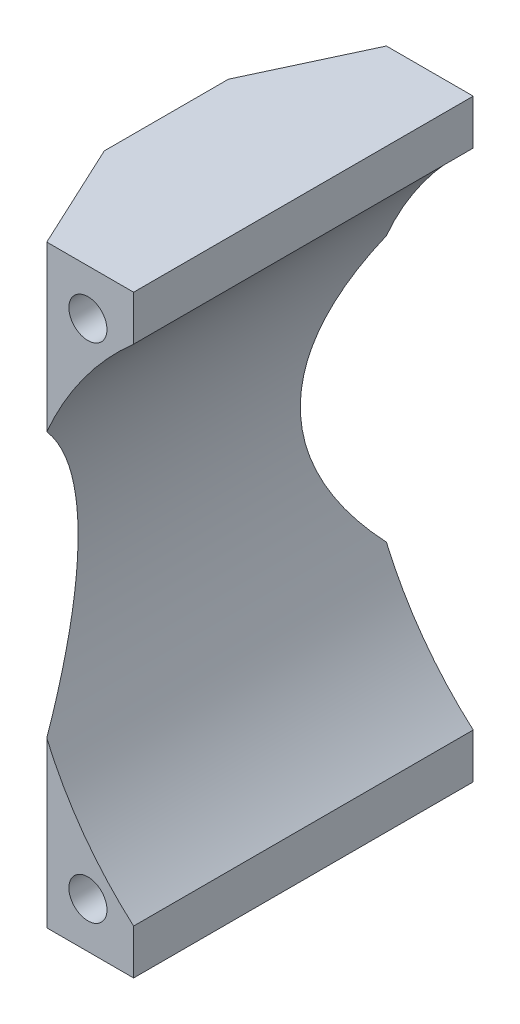
ISO-10303-21;
HEADER;
FILE_DESCRIPTION(('STEP AP214'),'2;1');
FILE_NAME('part.step','',(''),(''),'','','');
FILE_SCHEMA(('AUTOMOTIVE_DESIGN { 1 0 10303 214 1 1 1 1 }'));
ENDSEC;
DATA;
#1=APPLICATION_CONTEXT('core data for automotive mechanical design processes');
#2=APPLICATION_PROTOCOL_DEFINITION('international standard','automotive_design',2000,#1);
#3=PRODUCT_CONTEXT('',#1,'mechanical');
#4=PRODUCT('Part','Part','',(#3));
#5=PRODUCT_RELATED_PRODUCT_CATEGORY('part','',(#4));
#6=PRODUCT_DEFINITION_FORMATION('','',#4);
#7=PRODUCT_DEFINITION_CONTEXT('part definition',#1,'design');
#8=PRODUCT_DEFINITION('design','',#6,#7);
#9=PRODUCT_DEFINITION_SHAPE('','',#8);
#10=(LENGTH_UNIT() NAMED_UNIT(*) SI_UNIT(.MILLI.,.METRE.));
#11=(NAMED_UNIT(*) PLANE_ANGLE_UNIT() SI_UNIT($,.RADIAN.));
#12=(NAMED_UNIT(*) SI_UNIT($,.STERADIAN.) SOLID_ANGLE_UNIT());
#13=UNCERTAINTY_MEASURE_WITH_UNIT(LENGTH_MEASURE(1.E-05),#10,'distance_accuracy_value','');
#14=(GEOMETRIC_REPRESENTATION_CONTEXT(3) GLOBAL_UNCERTAINTY_ASSIGNED_CONTEXT((#13)) GLOBAL_UNIT_ASSIGNED_CONTEXT((#10,
#11,#12)) REPRESENTATION_CONTEXT('',''));
#15=CARTESIAN_POINT('',(0.,0.,0.));
#16=DIRECTION('',(0.,0.,1.));
#17=DIRECTION('',(1.,0.,0.));
#18=AXIS2_PLACEMENT_3D('',#15,#16,#17);
#19=CARTESIAN_POINT('',(-8.49999999999999,-19.5,0.));
#20=DIRECTION('',(0.,0.,1.));
#21=DIRECTION('',(1.,0.,0.));
#22=AXIS2_PLACEMENT_3D('',#19,#20,#21);
#23=PLANE('',#22);
#24=CARTESIAN_POINT('',(-2.99999999999999,-16.5,0.));
#25=DIRECTION('',(0.,0.,-1.));
#26=DIRECTION('',(-1.,0.,0.));
#27=AXIS2_PLACEMENT_3D('',#24,#25,#26);
#28=CIRCLE('',#27,1.24999999999999);
#29=CARTESIAN_POINT('',(-4.24999999999998,-16.5,0.));
#30=VERTEX_POINT('',#29);
#31=EDGE_CURVE('E155',#30,#30,#28,.T.);
#32=ORIENTED_EDGE('',*,*,#31,.F.);
#33=EDGE_LOOP('',(#32));
#34=FACE_BOUND('',#33,.T.);
#35=DIRECTION('',(1.,0.,0.));
#36=VECTOR('',#35,1.);
#37=CARTESIAN_POINT('',(-8.49999999999999,-19.5,0.));
#38=LINE('',#37,#36);
#39=CARTESIAN_POINT('',(-5.70215405106995,-19.5,0.));
#40=VERTEX_POINT('',#39);
#41=CARTESIAN_POINT('',(0.,-19.5,0.));
#42=VERTEX_POINT('',#41);
#43=EDGE_CURVE('E186',#40,#42,#38,.T.);
#44=ORIENTED_EDGE('',*,*,#43,.F.);
#45=DIRECTION('',(0.,1.,0.));
#46=VECTOR('',#45,1.);
#47=CARTESIAN_POINT('',(-5.70215405106995,-19.5,0.));
#48=LINE('',#47,#46);
#49=CARTESIAN_POINT('',(-5.70215405106995,-8.71050926736423,0.));
#50=VERTEX_POINT('',#49);
#51=EDGE_CURVE('E220',#40,#50,#48,.T.);
#52=ORIENTED_EDGE('',*,*,#51,.T.);
#53=CARTESIAN_POINT('',(14.5,0.,0.));
#54=DIRECTION('',(0.,0.,1.));
#55=DIRECTION('',(1.,0.,0.));
#56=AXIS2_PLACEMENT_3D('',#53,#54,#55);
#57=CIRCLE('',#56,22.);
#58=CARTESIAN_POINT('',(0.,-16.5453921077743,0.));
#59=VERTEX_POINT('',#58);
#60=EDGE_CURVE('E178',#59,#50,#57,.F.);
#61=ORIENTED_EDGE('',*,*,#60,.F.);
#62=DIRECTION('',(0.,1.,0.));
#63=VECTOR('',#62,1.);
#64=CARTESIAN_POINT('',(0.,19.5,0.));
#65=LINE('',#64,#63);
#66=EDGE_CURVE('E199',#42,#59,#65,.T.);
#67=ORIENTED_EDGE('',*,*,#66,.F.);
#68=EDGE_LOOP('',(#44,#52,#61,#67));
#69=FACE_BOUND('',#68,.T.);
#70=ADVANCED_FACE('F36',(#34,#69),#23,.F.);
#71=CARTESIAN_POINT('',(-8.49999999999999,-19.5,22.3));
#72=DIRECTION('',(0.,0.,1.));
#73=DIRECTION('',(1.,0.,0.));
#74=AXIS2_PLACEMENT_3D('',#71,#72,#73);
#75=PLANE('',#74);
#76=CARTESIAN_POINT('',(-3.,16.5,22.3));
#77=DIRECTION('',(0.,0.,1.));
#78=DIRECTION('',(1.,0.,0.));
#79=AXIS2_PLACEMENT_3D('',#76,#77,#78);
#80=CIRCLE('',#79,1.24999999999999);
#81=CARTESIAN_POINT('',(-1.75000000000001,16.5,22.3));
#82=VERTEX_POINT('',#81);
#83=EDGE_CURVE('E167',#82,#82,#80,.T.);
#84=ORIENTED_EDGE('',*,*,#83,.F.);
#85=EDGE_LOOP('',(#84));
#86=FACE_BOUND('',#85,.T.);
#87=DIRECTION('',(-1.,0.,0.));
#88=VECTOR('',#87,1.);
#89=CARTESIAN_POINT('',(-8.49999999999999,19.5,22.3));
#90=LINE('',#89,#88);
#91=CARTESIAN_POINT('',(0.,19.5,22.3));
#92=VERTEX_POINT('',#91);
#93=CARTESIAN_POINT('',(-5.70215405106995,19.5,22.3));
#94=VERTEX_POINT('',#93);
#95=EDGE_CURVE('E193',#92,#94,#90,.T.);
#96=ORIENTED_EDGE('',*,*,#95,.T.);
#97=DIRECTION('',(0.,-1.,0.));
#98=VECTOR('',#97,1.);
#99=CARTESIAN_POINT('',(-5.70215405106995,-19.5,22.3));
#100=LINE('',#99,#98);
#101=CARTESIAN_POINT('',(-5.70215405106995,8.71050926736423,22.3));
#102=VERTEX_POINT('',#101);
#103=EDGE_CURVE('E209',#94,#102,#100,.T.);
#104=ORIENTED_EDGE('',*,*,#103,.T.);
#105=CARTESIAN_POINT('',(14.5,0.,22.3));
#106=DIRECTION('',(0.,0.,1.));
#107=DIRECTION('',(1.,0.,0.));
#108=AXIS2_PLACEMENT_3D('',#105,#106,#107);
#109=CIRCLE('',#108,22.);
#110=CARTESIAN_POINT('',(0.,16.5453921077743,22.3));
#111=VERTEX_POINT('',#110);
#112=EDGE_CURVE('E174',#111,#102,#109,.T.);
#113=ORIENTED_EDGE('',*,*,#112,.F.);
#114=DIRECTION('',(0.,1.,0.));
#115=VECTOR('',#114,1.);
#116=CARTESIAN_POINT('',(0.,19.5,22.3));
#117=LINE('',#116,#115);
#118=EDGE_CURVE('E189',#111,#92,#117,.T.);
#119=ORIENTED_EDGE('',*,*,#118,.T.);
#120=EDGE_LOOP('',(#96,#104,#113,#119));
#121=FACE_BOUND('',#120,.T.);
#122=ADVANCED_FACE('F243',(#86,#121),#75,.T.);
#123=CARTESIAN_POINT('',(0.,19.5,22.3));
#124=DIRECTION('',(-1.,0.,0.));
#125=DIRECTION('',(0.,0.,1.));
#126=AXIS2_PLACEMENT_3D('',#123,#124,#125);
#127=PLANE('',#126);
#128=ORIENTED_EDGE('',*,*,#66,.T.);
#129=DIRECTION('',(0.,0.,1.));
#130=VECTOR('',#129,1.);
#131=CARTESIAN_POINT('',(0.,-16.5453921077743,-62.2253967444162));
#132=LINE('',#131,#130);
#133=CARTESIAN_POINT('',(0.,-16.5453921077743,22.3));
#134=VERTEX_POINT('',#133);
#135=EDGE_CURVE('E183',#59,#134,#132,.T.);
#136=ORIENTED_EDGE('',*,*,#135,.T.);
#137=CARTESIAN_POINT('',(0.,-19.5,22.3));
#138=VERTEX_POINT('',#137);
#139=EDGE_CURVE('E190',#138,#134,#117,.T.);
#140=ORIENTED_EDGE('',*,*,#139,.F.);
#141=DIRECTION('',(0.,0.,-1.));
#142=VECTOR('',#141,1.);
#143=CARTESIAN_POINT('',(0.,-19.5,22.3));
#144=LINE('',#143,#142);
#145=EDGE_CURVE('E204',#138,#42,#144,.T.);
#146=ORIENTED_EDGE('',*,*,#145,.T.);
#147=EDGE_LOOP('',(#128,#136,#140,#146));
#148=FACE_BOUND('',#147,.T.);
#149=ADVANCED_FACE('F229',(#148),#127,.F.);
#150=CARTESIAN_POINT('',(-8.49999999999999,-19.5,22.3));
#151=DIRECTION('',(0.,1.,0.));
#152=DIRECTION('',(0.,0.,1.));
#153=AXIS2_PLACEMENT_3D('',#150,#151,#152);
#154=PLANE('',#153);
#155=DIRECTION('',(-0.422618261740705,0.,-0.906307787036647));
#156=VECTOR('',#155,1.);
#157=CARTESIAN_POINT('',(-5.70215405106995,-19.5,22.3));
#158=LINE('',#157,#156);
#159=CARTESIAN_POINT('',(-5.70215405106995,-19.5,22.3));
#160=VERTEX_POINT('',#159);
#161=CARTESIAN_POINT('',(-9.,-19.5,15.2277465397452));
#162=VERTEX_POINT('',#161);
#163=EDGE_CURVE('E214',#160,#162,#158,.T.);
#164=ORIENTED_EDGE('',*,*,#163,.T.);
#165=DIRECTION('',(0.,0.,-1.));
#166=VECTOR('',#165,1.);
#167=CARTESIAN_POINT('',(-9.,-19.5,15.2277465397452));
#168=LINE('',#167,#166);
#169=CARTESIAN_POINT('',(-9.,-19.5,7.07225346025479));
#170=VERTEX_POINT('',#169);
#171=EDGE_CURVE('E147',#162,#170,#168,.T.);
#172=ORIENTED_EDGE('',*,*,#171,.T.);
#173=DIRECTION('',(-0.422618261740705,0.,0.906307787036647));
#174=VECTOR('',#173,1.);
#175=CARTESIAN_POINT('',(-8.49999999999999,-19.5,6.00000000000002));
#176=LINE('',#175,#174);
#177=EDGE_CURVE('E135',#170,#40,#176,.F.);
#178=ORIENTED_EDGE('',*,*,#177,.T.);
#179=ORIENTED_EDGE('',*,*,#43,.T.);
#180=ORIENTED_EDGE('',*,*,#145,.F.);
#181=DIRECTION('',(1.,0.,0.));
#182=VECTOR('',#181,1.);
#183=CARTESIAN_POINT('',(-8.49999999999999,-19.5,22.3));
#184=LINE('',#183,#182);
#185=EDGE_CURVE('E187',#160,#138,#184,.T.);
#186=ORIENTED_EDGE('',*,*,#185,.F.);
#187=EDGE_LOOP('',(#164,#172,#178,#179,#180,#186));
#188=FACE_BOUND('',#187,.T.);
#189=ADVANCED_FACE('F237',(#188),#154,.F.);
#190=ORIENTED_EDGE('',*,*,#118,.F.);
#191=DIRECTION('',(0.,0.,1.));
#192=VECTOR('',#191,1.);
#193=CARTESIAN_POINT('',(0.,16.5453921077743,-62.2253967444162));
#194=LINE('',#193,#192);
#195=CARTESIAN_POINT('',(0.,16.5453921077743,0.));
#196=VERTEX_POINT('',#195);
#197=EDGE_CURVE('E180',#111,#196,#194,.F.);
#198=ORIENTED_EDGE('',*,*,#197,.T.);
#199=CARTESIAN_POINT('',(0.,19.5,0.));
#200=VERTEX_POINT('',#199);
#201=EDGE_CURVE('E198',#196,#200,#65,.T.);
#202=ORIENTED_EDGE('',*,*,#201,.T.);
#203=DIRECTION('',(0.,0.,-1.));
#204=VECTOR('',#203,1.);
#205=CARTESIAN_POINT('',(0.,19.5,22.3));
#206=LINE('',#205,#204);
#207=EDGE_CURVE('E196',#92,#200,#206,.T.);
#208=ORIENTED_EDGE('',*,*,#207,.F.);
#209=EDGE_LOOP('',(#190,#198,#202,#208));
#210=FACE_BOUND('',#209,.T.);
#211=ADVANCED_FACE('F248',(#210),#127,.F.);
#212=CARTESIAN_POINT('',(-8.49999999999999,19.5,22.3));
#213=DIRECTION('',(0.,-1.,0.));
#214=DIRECTION('',(0.,0.,-1.));
#215=AXIS2_PLACEMENT_3D('',#212,#213,#214);
#216=PLANE('',#215);
#217=DIRECTION('',(-1.,0.,0.));
#218=VECTOR('',#217,1.);
#219=CARTESIAN_POINT('',(-8.49999999999999,19.5,0.));
#220=LINE('',#219,#218);
#221=CARTESIAN_POINT('',(-5.70215405106995,19.5,0.));
#222=VERTEX_POINT('',#221);
#223=EDGE_CURVE('E130',#200,#222,#220,.T.);
#224=ORIENTED_EDGE('',*,*,#223,.T.);
#225=DIRECTION('',(0.422618261740705,0.,-0.906307787036647));
#226=VECTOR('',#225,1.);
#227=CARTESIAN_POINT('',(-8.49999999999999,19.5,6.00000000000002));
#228=LINE('',#227,#226);
#229=CARTESIAN_POINT('',(-9.,19.5,7.07225346025479));
#230=VERTEX_POINT('',#229);
#231=EDGE_CURVE('E11',#222,#230,#228,.F.);
#232=ORIENTED_EDGE('',*,*,#231,.T.);
#233=DIRECTION('',(0.,0.,1.));
#234=VECTOR('',#233,1.);
#235=CARTESIAN_POINT('',(-9.,19.5,15.2277465397452));
#236=LINE('',#235,#234);
#237=CARTESIAN_POINT('',(-9.,19.5,15.2277465397452));
#238=VERTEX_POINT('',#237);
#239=EDGE_CURVE('E128',#230,#238,#236,.T.);
#240=ORIENTED_EDGE('',*,*,#239,.T.);
#241=DIRECTION('',(0.422618261740705,0.,0.906307787036647));
#242=VECTOR('',#241,1.);
#243=CARTESIAN_POINT('',(-5.70215405106995,19.5,22.3));
#244=LINE('',#243,#242);
#245=EDGE_CURVE('E216',#238,#94,#244,.T.);
#246=ORIENTED_EDGE('',*,*,#245,.T.);
#247=ORIENTED_EDGE('',*,*,#95,.F.);
#248=ORIENTED_EDGE('',*,*,#207,.T.);
#249=EDGE_LOOP('',(#224,#232,#240,#246,#247,#248));
#250=FACE_BOUND('',#249,.T.);
#251=ADVANCED_FACE('F126',(#250),#216,.F.);
#252=CARTESIAN_POINT('',(-2.99999999999999,-16.5,22.3));
#253=DIRECTION('',(0.,0.,1.));
#254=DIRECTION('',(1.,0.,0.));
#255=AXIS2_PLACEMENT_3D('',#252,#253,#254);
#256=CIRCLE('',#255,1.24999999999999);
#257=CARTESIAN_POINT('',(-1.75,-16.5,22.3));
#258=VERTEX_POINT('',#257);
#259=EDGE_CURVE('E149',#258,#258,#256,.T.);
#260=ORIENTED_EDGE('',*,*,#259,.F.);
#261=EDGE_LOOP('',(#260));
#262=FACE_BOUND('',#261,.T.);
#263=CARTESIAN_POINT('',(-5.70215405106995,-8.71050926736423,22.3));
#264=VERTEX_POINT('',#263);
#265=EDGE_CURVE('E173',#264,#134,#109,.T.);
#266=ORIENTED_EDGE('',*,*,#265,.F.);
#267=DIRECTION('',(0.,-1.,0.));
#268=VECTOR('',#267,1.);
#269=CARTESIAN_POINT('',(-5.70215405106995,-19.5,22.3));
#270=LINE('',#269,#268);
#271=EDGE_CURVE('E207',#264,#160,#270,.T.);
#272=ORIENTED_EDGE('',*,*,#271,.T.);
#273=ORIENTED_EDGE('',*,*,#185,.T.);
#274=ORIENTED_EDGE('',*,*,#139,.T.);
#275=EDGE_LOOP('',(#266,#272,#273,#274));
#276=FACE_BOUND('',#275,.T.);
#277=ADVANCED_FACE('F231',(#262,#276),#75,.T.);
#278=CARTESIAN_POINT('',(-3.,16.5,0.));
#279=DIRECTION('',(0.,0.,-1.));
#280=DIRECTION('',(-1.,0.,0.));
#281=AXIS2_PLACEMENT_3D('',#278,#279,#280);
#282=CIRCLE('',#281,1.24999999999999);
#283=CARTESIAN_POINT('',(-4.24999999999998,16.5,0.));
#284=VERTEX_POINT('',#283);
#285=EDGE_CURVE('E161',#284,#284,#282,.T.);
#286=ORIENTED_EDGE('',*,*,#285,.F.);
#287=EDGE_LOOP('',(#286));
#288=FACE_BOUND('',#287,.T.);
#289=CARTESIAN_POINT('',(-5.70215405106995,8.71050926736423,0.));
#290=VERTEX_POINT('',#289);
#291=EDGE_CURVE('E177',#290,#196,#57,.F.);
#292=ORIENTED_EDGE('',*,*,#291,.F.);
#293=DIRECTION('',(0.,1.,0.));
#294=VECTOR('',#293,1.);
#295=CARTESIAN_POINT('',(-5.70215405106995,-19.5,0.));
#296=LINE('',#295,#294);
#297=EDGE_CURVE('E51',#290,#222,#296,.T.);
#298=ORIENTED_EDGE('',*,*,#297,.T.);
#299=ORIENTED_EDGE('',*,*,#223,.F.);
#300=ORIENTED_EDGE('',*,*,#201,.F.);
#301=EDGE_LOOP('',(#292,#298,#299,#300));
#302=FACE_BOUND('',#301,.T.);
#303=ADVANCED_FACE('F250',(#288,#302),#23,.F.);
#304=CARTESIAN_POINT('',(14.5,0.,-62.2253967444162));
#305=DIRECTION('',(0.,0.,1.));
#306=DIRECTION('',(1.,0.,0.));
#307=AXIS2_PLACEMENT_3D('',#304,#305,#306);
#308=CYLINDRICAL_SURFACE('',#307,22.);
#309=ORIENTED_EDGE('',*,*,#60,.T.);
#310=CARTESIAN_POINT('',(14.5,0.,-43.323659171719));
#311=DIRECTION('',(0.906307787036647,0.,0.422618261740705));
#312=DIRECTION('',(-0.422618261740705,0.,0.906307787036647));
#313=AXIS2_PLACEMENT_3D('',#310,#311,#312);
#314=ELLIPSE('',#313,52.0564348293542,22.);
#315=EDGE_CURVE('E44',#50,#290,#314,.F.);
#316=ORIENTED_EDGE('',*,*,#315,.T.);
#317=ORIENTED_EDGE('',*,*,#291,.T.);
#318=ORIENTED_EDGE('',*,*,#197,.F.);
#319=ORIENTED_EDGE('',*,*,#112,.T.);
#320=CARTESIAN_POINT('',(14.5,0.,65.623659171719));
#321=DIRECTION('',(-0.906307787036647,0.,0.422618261740705));
#322=DIRECTION('',(0.422618261740705,0.,0.906307787036647));
#323=AXIS2_PLACEMENT_3D('',#320,#321,#322);
#324=ELLIPSE('',#323,52.0564348293542,22.);
#325=EDGE_CURVE('E212',#102,#264,#324,.T.);
#326=ORIENTED_EDGE('',*,*,#325,.T.);
#327=ORIENTED_EDGE('',*,*,#265,.T.);
#328=ORIENTED_EDGE('',*,*,#135,.F.);
#329=EDGE_LOOP('',(#309,#316,#317,#318,#319,#326,#327,#328));
#330=FACE_BOUND('',#329,.T.);
#331=ADVANCED_FACE('F225',(#330),#308,.F.);
#332=CARTESIAN_POINT('',(-3.,16.5,12.8));
#333=DIRECTION('',(0.,0.,1.));
#334=DIRECTION('',(1.,0.,0.));
#335=AXIS2_PLACEMENT_3D('',#332,#333,#334);
#336=CONICAL_SURFACE('',#335,1.24999999999999,1.02974425867665);
#337=CARTESIAN_POINT('',(-3.,16.5,12.0489242262156));
#338=VERTEX_POINT('',#337);
#339=VERTEX_LOOP('',#338);
#340=FACE_BOUND('',#339,.T.);
#341=CARTESIAN_POINT('',(-3.,16.5,12.8));
#342=DIRECTION('',(0.,0.,1.));
#343=DIRECTION('',(1.,0.,0.));
#344=AXIS2_PLACEMENT_3D('',#341,#342,#343);
#345=CIRCLE('',#344,1.24999999999999);
#346=CARTESIAN_POINT('',(-1.75000000000001,16.5,12.8));
#347=VERTEX_POINT('',#346);
#348=EDGE_CURVE('E170',#347,#347,#345,.T.);
#349=ORIENTED_EDGE('',*,*,#348,.T.);
#350=EDGE_LOOP('',(#349));
#351=FACE_BOUND('',#350,.T.);
#352=ADVANCED_FACE('F258',(#340,#351),#336,.F.);
#353=CARTESIAN_POINT('',(-3.,16.5,22.3));
#354=DIRECTION('',(0.,0.,1.));
#355=DIRECTION('',(1.,0.,0.));
#356=AXIS2_PLACEMENT_3D('',#353,#354,#355);
#357=CYLINDRICAL_SURFACE('',#356,1.24999999999999);
#358=ORIENTED_EDGE('',*,*,#348,.F.);
#359=EDGE_LOOP('',(#358));
#360=FACE_BOUND('',#359,.T.);
#361=ORIENTED_EDGE('',*,*,#83,.T.);
#362=EDGE_LOOP('',(#361));
#363=FACE_BOUND('',#362,.T.);
#364=ADVANCED_FACE('F297',(#360,#363),#357,.F.);
#365=CARTESIAN_POINT('',(-3.,16.5,9.49999999999999));
#366=DIRECTION('',(0.,0.,-1.));
#367=DIRECTION('',(-1.,0.,0.));
#368=AXIS2_PLACEMENT_3D('',#365,#366,#367);
#369=CONICAL_SURFACE('',#368,1.24999999999999,1.02974425867665);
#370=CARTESIAN_POINT('',(-3.,16.5,10.2510757737845));
#371=VERTEX_POINT('',#370);
#372=VERTEX_LOOP('',#371);
#373=FACE_BOUND('',#372,.T.);
#374=CARTESIAN_POINT('',(-3.,16.5,9.49999999999999));
#375=DIRECTION('',(0.,0.,-1.));
#376=DIRECTION('',(-1.,0.,0.));
#377=AXIS2_PLACEMENT_3D('',#374,#375,#376);
#378=CIRCLE('',#377,1.24999999999999);
#379=CARTESIAN_POINT('',(-4.24999999999998,16.5,9.49999999999999));
#380=VERTEX_POINT('',#379);
#381=EDGE_CURVE('E164',#380,#380,#378,.T.);
#382=ORIENTED_EDGE('',*,*,#381,.T.);
#383=EDGE_LOOP('',(#382));
#384=FACE_BOUND('',#383,.T.);
#385=ADVANCED_FACE('F293',(#373,#384),#369,.F.);
#386=CARTESIAN_POINT('',(-3.,16.5,0.));
#387=DIRECTION('',(0.,0.,-1.));
#388=DIRECTION('',(-1.,0.,0.));
#389=AXIS2_PLACEMENT_3D('',#386,#387,#388);
#390=CYLINDRICAL_SURFACE('',#389,1.24999999999999);
#391=ORIENTED_EDGE('',*,*,#381,.F.);
#392=EDGE_LOOP('',(#391));
#393=FACE_BOUND('',#392,.T.);
#394=ORIENTED_EDGE('',*,*,#285,.T.);
#395=EDGE_LOOP('',(#394));
#396=FACE_BOUND('',#395,.T.);
#397=ADVANCED_FACE('F285',(#393,#396),#390,.F.);
#398=CARTESIAN_POINT('',(-2.99999999999999,-16.5,9.5));
#399=DIRECTION('',(0.,0.,-1.));
#400=DIRECTION('',(-1.,0.,0.));
#401=AXIS2_PLACEMENT_3D('',#398,#399,#400);
#402=CONICAL_SURFACE('',#401,1.25,1.02974425867665);
#403=CARTESIAN_POINT('',(-2.99999999999999,-16.5,10.2510757737845));
#404=VERTEX_POINT('',#403);
#405=VERTEX_LOOP('',#404);
#406=FACE_BOUND('',#405,.T.);
#407=CARTESIAN_POINT('',(-2.99999999999999,-16.5,9.5));
#408=DIRECTION('',(0.,0.,-1.));
#409=DIRECTION('',(-1.,0.,0.));
#410=AXIS2_PLACEMENT_3D('',#407,#408,#409);
#411=CIRCLE('',#410,1.25);
#412=CARTESIAN_POINT('',(-4.24999999999999,-16.5,9.5));
#413=VERTEX_POINT('',#412);
#414=EDGE_CURVE('E158',#413,#413,#411,.T.);
#415=ORIENTED_EDGE('',*,*,#414,.T.);
#416=EDGE_LOOP('',(#415));
#417=FACE_BOUND('',#416,.T.);
#418=ADVANCED_FACE('F275',(#406,#417),#402,.F.);
#419=CARTESIAN_POINT('',(-2.99999999999999,-16.5,0.));
#420=DIRECTION('',(0.,0.,-1.));
#421=DIRECTION('',(-1.,0.,0.));
#422=AXIS2_PLACEMENT_3D('',#419,#420,#421);
#423=CYLINDRICAL_SURFACE('',#422,1.24999999999999);
#424=ORIENTED_EDGE('',*,*,#414,.F.);
#425=EDGE_LOOP('',(#424));
#426=FACE_BOUND('',#425,.T.);
#427=ORIENTED_EDGE('',*,*,#31,.T.);
#428=EDGE_LOOP('',(#427));
#429=FACE_BOUND('',#428,.T.);
#430=ADVANCED_FACE('F272',(#426,#429),#423,.F.);
#431=CARTESIAN_POINT('',(-2.99999999999999,-16.5,12.8));
#432=DIRECTION('',(0.,0.,1.));
#433=DIRECTION('',(1.,0.,0.));
#434=AXIS2_PLACEMENT_3D('',#431,#432,#433);
#435=CONICAL_SURFACE('',#434,1.25,1.02974425867665);
#436=CARTESIAN_POINT('',(-2.99999999999999,-16.5,12.0489242262155));
#437=VERTEX_POINT('',#436);
#438=VERTEX_LOOP('',#437);
#439=FACE_BOUND('',#438,.T.);
#440=CARTESIAN_POINT('',(-2.99999999999999,-16.5,12.8));
#441=DIRECTION('',(0.,0.,1.));
#442=DIRECTION('',(1.,0.,0.));
#443=AXIS2_PLACEMENT_3D('',#440,#441,#442);
#444=CIRCLE('',#443,1.25);
#445=CARTESIAN_POINT('',(-1.74999999999999,-16.5,12.8));
#446=VERTEX_POINT('',#445);
#447=EDGE_CURVE('E152',#446,#446,#444,.T.);
#448=ORIENTED_EDGE('',*,*,#447,.T.);
#449=EDGE_LOOP('',(#448));
#450=FACE_BOUND('',#449,.T.);
#451=ADVANCED_FACE('F274',(#439,#450),#435,.F.);
#452=CARTESIAN_POINT('',(-2.99999999999999,-16.5,22.3));
#453=DIRECTION('',(0.,0.,1.));
#454=DIRECTION('',(1.,0.,0.));
#455=AXIS2_PLACEMENT_3D('',#452,#453,#454);
#456=CYLINDRICAL_SURFACE('',#455,1.24999999999999);
#457=ORIENTED_EDGE('',*,*,#447,.F.);
#458=EDGE_LOOP('',(#457));
#459=FACE_BOUND('',#458,.T.);
#460=ORIENTED_EDGE('',*,*,#259,.T.);
#461=EDGE_LOOP('',(#460));
#462=FACE_BOUND('',#461,.T.);
#463=ADVANCED_FACE('F282',(#459,#462),#456,.F.);
#464=CARTESIAN_POINT('',(-5.70215405106995,-19.5,22.3));
#465=DIRECTION('',(-0.906307787036647,0.,0.422618261740705));
#466=DIRECTION('',(0.422618261740705,0.,0.906307787036647));
#467=AXIS2_PLACEMENT_3D('',#464,#465,#466);
#468=PLANE('',#467);
#469=ORIENTED_EDGE('',*,*,#245,.F.);
#470=DIRECTION('',(0.,1.,0.));
#471=VECTOR('',#470,1.);
#472=CARTESIAN_POINT('',(-9.,-29.8121287811974,15.2277465397452));
#473=LINE('',#472,#471);
#474=EDGE_CURVE('E139',#162,#238,#473,.T.);
#475=ORIENTED_EDGE('',*,*,#474,.F.);
#476=ORIENTED_EDGE('',*,*,#163,.F.);
#477=ORIENTED_EDGE('',*,*,#271,.F.);
#478=ORIENTED_EDGE('',*,*,#325,.F.);
#479=ORIENTED_EDGE('',*,*,#103,.F.);
#480=EDGE_LOOP('',(#469,#475,#476,#477,#478,#479));
#481=FACE_BOUND('',#480,.T.);
#482=ADVANCED_FACE('F239',(#481),#468,.T.);
#483=CARTESIAN_POINT('',(-8.49999999999999,19.5,6.00000000000002));
#484=DIRECTION('',(0.906307787036647,0.,0.422618261740705));
#485=DIRECTION('',(0.422618261740705,0.,-0.906307787036647));
#486=AXIS2_PLACEMENT_3D('',#483,#484,#485);
#487=PLANE('',#486);
#488=ORIENTED_EDGE('',*,*,#315,.F.);
#489=ORIENTED_EDGE('',*,*,#51,.F.);
#490=ORIENTED_EDGE('',*,*,#177,.F.);
#491=DIRECTION('',(0.,1.,0.));
#492=VECTOR('',#491,1.);
#493=CARTESIAN_POINT('',(-9.,-29.8121287811974,7.07225346025479));
#494=LINE('',#493,#492);
#495=EDGE_CURVE('E133',#170,#230,#494,.T.);
#496=ORIENTED_EDGE('',*,*,#495,.T.);
#497=ORIENTED_EDGE('',*,*,#231,.F.);
#498=ORIENTED_EDGE('',*,*,#297,.F.);
#499=EDGE_LOOP('',(#488,#489,#490,#496,#497,#498));
#500=FACE_BOUND('',#499,.T.);
#501=ADVANCED_FACE('F38',(#500),#487,.F.);
#502=CARTESIAN_POINT('',(-9.,-29.8121287811974,15.2277465397452));
#503=DIRECTION('',(-1.,0.,0.));
#504=DIRECTION('',(0.,0.,1.));
#505=AXIS2_PLACEMENT_3D('',#502,#503,#504);
#506=PLANE('',#505);
#507=ORIENTED_EDGE('',*,*,#171,.F.);
#508=ORIENTED_EDGE('',*,*,#474,.T.);
#509=ORIENTED_EDGE('',*,*,#239,.F.);
#510=ORIENTED_EDGE('',*,*,#495,.F.);
#511=EDGE_LOOP('',(#507,#508,#509,#510));
#512=FACE_BOUND('',#511,.T.);
#513=ADVANCED_FACE('F142',(#512),#506,.T.);
#514=CLOSED_SHELL('',(#70,#122,#149,#189,#211,#251,#277,#303,#331,#352,#364,#385,#397,#418,#430,
#451,#463,#482,#501,#513));
#515=MANIFOLD_SOLID_BREP('B2',#514);
#516=ADVANCED_BREP_SHAPE_REPRESENTATION('',(#18,#515),#14);
#517=SHAPE_DEFINITION_REPRESENTATION(#9,#516);
ENDSEC;
END-ISO-10303-21;
